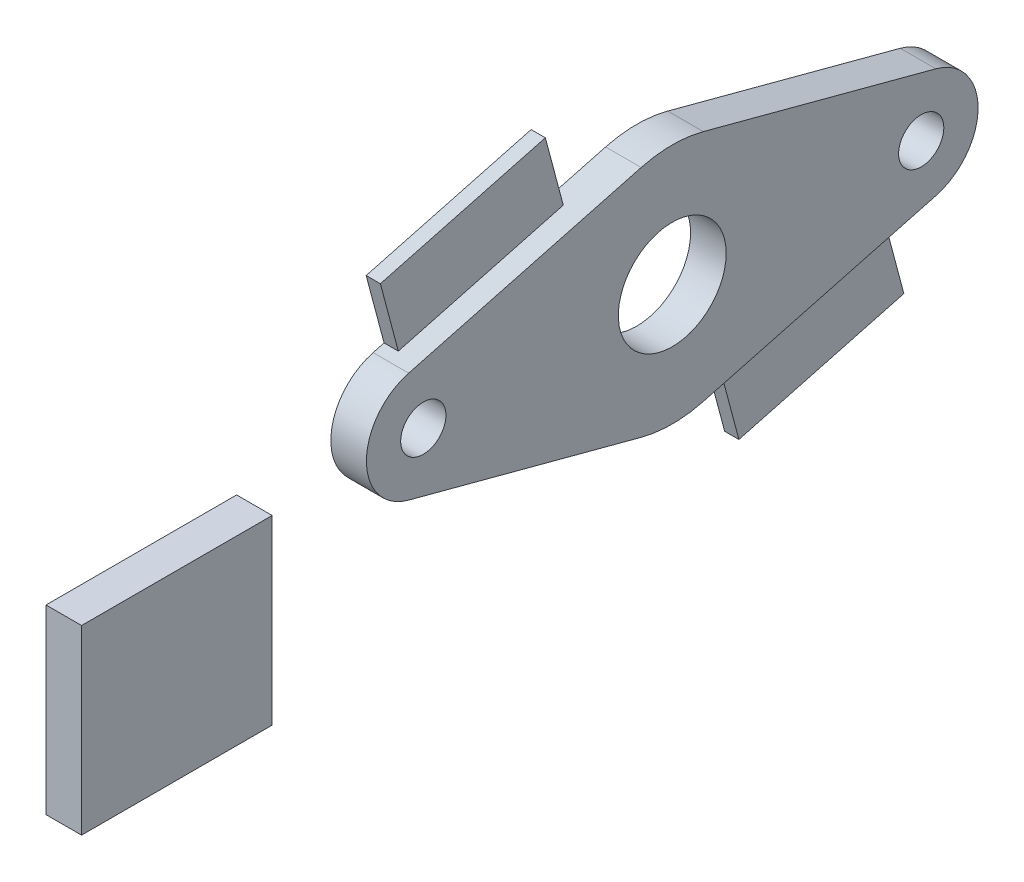
ISO-10303-21;
HEADER;
FILE_DESCRIPTION(('STEP AP214'),'2;1');
FILE_NAME('part.step','',(''),(''),'','','');
FILE_SCHEMA(('AUTOMOTIVE_DESIGN { 1 0 10303 214 1 1 1 1 }'));
ENDSEC;
DATA;
#1=APPLICATION_CONTEXT('core data for automotive mechanical design processes');
#2=APPLICATION_PROTOCOL_DEFINITION('international standard','automotive_design',2000,#1);
#3=PRODUCT_CONTEXT('',#1,'mechanical');
#4=PRODUCT('Part','Part','',(#3));
#5=PRODUCT_RELATED_PRODUCT_CATEGORY('part','',(#4));
#6=PRODUCT_DEFINITION_FORMATION('','',#4);
#7=PRODUCT_DEFINITION_CONTEXT('part definition',#1,'design');
#8=PRODUCT_DEFINITION('design','',#6,#7);
#9=PRODUCT_DEFINITION_SHAPE('','',#8);
#10=(LENGTH_UNIT() NAMED_UNIT(*) SI_UNIT(.MILLI.,.METRE.));
#11=(NAMED_UNIT(*) PLANE_ANGLE_UNIT() SI_UNIT($,.RADIAN.));
#12=(NAMED_UNIT(*) SI_UNIT($,.STERADIAN.) SOLID_ANGLE_UNIT());
#13=UNCERTAINTY_MEASURE_WITH_UNIT(LENGTH_MEASURE(1.E-05),#10,'distance_accuracy_value','');
#14=(GEOMETRIC_REPRESENTATION_CONTEXT(3) GLOBAL_UNCERTAINTY_ASSIGNED_CONTEXT((#13)) GLOBAL_UNIT_ASSIGNED_CONTEXT((#10,
#11,#12)) REPRESENTATION_CONTEXT('',''));
#15=CARTESIAN_POINT('',(0.,0.,0.));
#16=DIRECTION('',(0.,0.,1.));
#17=DIRECTION('',(1.,0.,0.));
#18=AXIS2_PLACEMENT_3D('',#15,#16,#17);
#19=CARTESIAN_POINT('',(-3.175,0.,22.225));
#20=DIRECTION('',(-1.,0.,0.));
#21=DIRECTION('',(0.,0.,1.));
#22=AXIS2_PLACEMENT_3D('',#19,#20,#21);
#23=PLANE('',#22);
#24=DIRECTION('',(0.,1.,0.));
#25=VECTOR('',#24,1.);
#26=CARTESIAN_POINT('',(-3.175,-16.2109368753439,35.7172212776602));
#27=LINE('',#26,#25);
#28=CARTESIAN_POINT('',(-3.175,-16.2109368753439,35.7172212776602));
#29=VERTEX_POINT('',#28);
#30=CARTESIAN_POINT('',(-3.175,0.,35.7172212776602));
#31=VERTEX_POINT('',#30);
#32=EDGE_CURVE('E57',#29,#31,#27,.T.);
#33=ORIENTED_EDGE('',*,*,#32,.F.);
#34=DIRECTION('',(0.,0.,-1.));
#35=VECTOR('',#34,1.);
#36=CARTESIAN_POINT('',(-3.175,-16.2109368753439,35.7172212776602));
#37=LINE('',#36,#35);
#38=CARTESIAN_POINT('',(-3.175,-16.2109368753439,52.7326155470547));
#39=VERTEX_POINT('',#38);
#40=EDGE_CURVE('E80',#39,#29,#37,.T.);
#41=ORIENTED_EDGE('',*,*,#40,.F.);
#42=DIRECTION('',(0.,-1.,0.));
#43=VECTOR('',#42,1.);
#44=CARTESIAN_POINT('',(-3.175,-16.2109368753439,52.7326155470547));
#45=LINE('',#44,#43);
#46=CARTESIAN_POINT('',(-3.175,0.,52.7326155470547));
#47=VERTEX_POINT('',#46);
#48=EDGE_CURVE('E85',#47,#39,#45,.T.);
#49=ORIENTED_EDGE('',*,*,#48,.F.);
#50=DIRECTION('',(0.,0.,1.));
#51=VECTOR('',#50,1.);
#52=CARTESIAN_POINT('',(-3.175,0.,35.7172212776602));
#53=LINE('',#52,#51);
#54=EDGE_CURVE('E100',#31,#47,#53,.T.);
#55=ORIENTED_EDGE('',*,*,#54,.F.);
#56=EDGE_LOOP('',(#33,#41,#49,#55));
#57=FACE_BOUND('',#56,.T.);
#58=ADVANCED_FACE('F49',(#57),#23,.T.);
#59=CARTESIAN_POINT('',(0.,0.,0.));
#60=DIRECTION('',(1.,0.,0.));
#61=DIRECTION('',(0.,0.,-1.));
#62=AXIS2_PLACEMENT_3D('',#59,#60,#61);
#63=PLANE('',#62);
#64=DIRECTION('',(0.,1.,0.));
#65=VECTOR('',#64,1.);
#66=CARTESIAN_POINT('',(0.,-16.2109368753439,35.7172212776602));
#67=LINE('',#66,#65);
#68=CARTESIAN_POINT('',(0.,-16.2109368753439,35.7172212776602));
#69=VERTEX_POINT('',#68);
#70=CARTESIAN_POINT('',(0.,0.,35.7172212776602));
#71=VERTEX_POINT('',#70);
#72=EDGE_CURVE('E109',#69,#71,#67,.T.);
#73=ORIENTED_EDGE('',*,*,#72,.T.);
#74=DIRECTION('',(0.,0.,1.));
#75=VECTOR('',#74,1.);
#76=CARTESIAN_POINT('',(0.,0.,35.7172212776602));
#77=LINE('',#76,#75);
#78=CARTESIAN_POINT('',(0.,0.,52.7326155470547));
#79=VERTEX_POINT('',#78);
#80=EDGE_CURVE('E98',#71,#79,#77,.T.);
#81=ORIENTED_EDGE('',*,*,#80,.T.);
#82=DIRECTION('',(0.,-1.,0.));
#83=VECTOR('',#82,1.);
#84=CARTESIAN_POINT('',(0.,-16.2109368753439,52.7326155470547));
#85=LINE('',#84,#83);
#86=CARTESIAN_POINT('',(0.,-16.2109368753439,52.7326155470547));
#87=VERTEX_POINT('',#86);
#88=EDGE_CURVE('E101',#79,#87,#85,.T.);
#89=ORIENTED_EDGE('',*,*,#88,.T.);
#90=DIRECTION('',(0.,0.,-1.));
#91=VECTOR('',#90,1.);
#92=CARTESIAN_POINT('',(0.,-16.2109368753439,35.7172212776602));
#93=LINE('',#92,#91);
#94=EDGE_CURVE('E106',#87,#69,#93,.T.);
#95=ORIENTED_EDGE('',*,*,#94,.T.);
#96=EDGE_LOOP('',(#73,#81,#89,#95));
#97=FACE_BOUND('',#96,.T.);
#98=ADVANCED_FACE('F108',(#97),#63,.T.);
#99=CARTESIAN_POINT('',(-26.6764492429579,0.,35.7172212776602));
#100=DIRECTION('',(0.,1.,0.));
#101=DIRECTION('',(0.,0.,1.));
#102=AXIS2_PLACEMENT_3D('',#99,#100,#101);
#103=PLANE('',#102);
#104=DIRECTION('',(1.,0.,0.));
#105=VECTOR('',#104,1.);
#106=CARTESIAN_POINT('',(-26.6764492429579,0.,35.7172212776602));
#107=LINE('',#106,#105);
#108=EDGE_CURVE('E12',#31,#71,#107,.T.);
#109=ORIENTED_EDGE('',*,*,#108,.F.);
#110=ORIENTED_EDGE('',*,*,#54,.T.);
#111=DIRECTION('',(1.,0.,0.));
#112=VECTOR('',#111,1.);
#113=CARTESIAN_POINT('',(-26.6764492429579,0.,52.7326155470547));
#114=LINE('',#113,#112);
#115=EDGE_CURVE('E95',#47,#79,#114,.T.);
#116=ORIENTED_EDGE('',*,*,#115,.T.);
#117=ORIENTED_EDGE('',*,*,#80,.F.);
#118=EDGE_LOOP('',(#109,#110,#116,#117));
#119=FACE_BOUND('',#118,.T.);
#120=ADVANCED_FACE('F96',(#119),#103,.T.);
#121=CARTESIAN_POINT('',(-26.6764492429579,-16.2109368753439,52.7326155470547));
#122=DIRECTION('',(0.,0.,1.));
#123=DIRECTION('',(1.,0.,0.));
#124=AXIS2_PLACEMENT_3D('',#121,#122,#123);
#125=PLANE('',#124);
#126=ORIENTED_EDGE('',*,*,#115,.F.);
#127=ORIENTED_EDGE('',*,*,#48,.T.);
#128=DIRECTION('',(1.,0.,0.));
#129=VECTOR('',#128,1.);
#130=CARTESIAN_POINT('',(-26.6764492429579,-16.2109368753439,52.7326155470547));
#131=LINE('',#130,#129);
#132=EDGE_CURVE('E90',#39,#87,#131,.T.);
#133=ORIENTED_EDGE('',*,*,#132,.T.);
#134=ORIENTED_EDGE('',*,*,#88,.F.);
#135=EDGE_LOOP('',(#126,#127,#133,#134));
#136=FACE_BOUND('',#135,.T.);
#137=ADVANCED_FACE('F102',(#136),#125,.T.);
#138=CARTESIAN_POINT('',(-26.6764492429579,-16.2109368753439,35.7172212776602));
#139=DIRECTION('',(0.,-1.,0.));
#140=DIRECTION('',(0.,0.,-1.));
#141=AXIS2_PLACEMENT_3D('',#138,#139,#140);
#142=PLANE('',#141);
#143=ORIENTED_EDGE('',*,*,#132,.F.);
#144=ORIENTED_EDGE('',*,*,#40,.T.);
#145=DIRECTION('',(1.,0.,0.));
#146=VECTOR('',#145,1.);
#147=CARTESIAN_POINT('',(-26.6764492429579,-16.2109368753439,35.7172212776602));
#148=LINE('',#147,#146);
#149=EDGE_CURVE('E116',#29,#69,#148,.T.);
#150=ORIENTED_EDGE('',*,*,#149,.T.);
#151=ORIENTED_EDGE('',*,*,#94,.F.);
#152=EDGE_LOOP('',(#143,#144,#150,#151));
#153=FACE_BOUND('',#152,.T.);
#154=ADVANCED_FACE('F122',(#153),#142,.T.);
#155=CARTESIAN_POINT('',(-26.6764492429579,-16.2109368753439,35.7172212776602));
#156=DIRECTION('',(0.,0.,-1.));
#157=DIRECTION('',(-1.,0.,0.));
#158=AXIS2_PLACEMENT_3D('',#155,#156,#157);
#159=PLANE('',#158);
#160=ORIENTED_EDGE('',*,*,#149,.F.);
#161=ORIENTED_EDGE('',*,*,#32,.T.);
#162=ORIENTED_EDGE('',*,*,#108,.T.);
#163=ORIENTED_EDGE('',*,*,#72,.F.);
#164=EDGE_LOOP('',(#160,#161,#162,#163));
#165=FACE_BOUND('',#164,.T.);
#166=ADVANCED_FACE('F123',(#165),#159,.T.);
#167=CLOSED_SHELL('',(#58,#98,#120,#137,#154,#166));
#168=MANIFOLD_SOLID_BREP('B2',#167);
#169=CARTESIAN_POINT('',(-3.175,0.,22.225));
#170=DIRECTION('',(1.,0.,0.));
#171=DIRECTION('',(0.,0.,-1.));
#172=AXIS2_PLACEMENT_3D('',#169,#170,#171);
#173=CYLINDRICAL_SURFACE('',#172,5.08);
#174=CARTESIAN_POINT('',(0.,0.,22.225));
#175=DIRECTION('',(1.,0.,0.));
#176=DIRECTION('',(0.,0.,1.));
#177=AXIS2_PLACEMENT_3D('',#174,#175,#176);
#178=CIRCLE('',#177,5.08);
#179=CARTESIAN_POINT('',(0.,4.90917687934067,23.5312857142857));
#180=VERTEX_POINT('',#179);
#181=CARTESIAN_POINT('',(0.,-4.90917687934068,23.5312857142857));
#182=VERTEX_POINT('',#181);
#183=EDGE_CURVE('E413',#180,#182,#178,.T.);
#184=ORIENTED_EDGE('',*,*,#183,.F.);
#185=DIRECTION('',(1.,0.,0.));
#186=VECTOR('',#185,1.);
#187=CARTESIAN_POINT('',(-3.175,4.90917687934067,23.5312857142857));
#188=LINE('',#187,#186);
#189=CARTESIAN_POINT('',(-3.175,4.90917687934067,23.5312857142857));
#190=VERTEX_POINT('',#189);
#191=EDGE_CURVE('E47',#190,#180,#188,.T.);
#192=ORIENTED_EDGE('',*,*,#191,.F.);
#193=CARTESIAN_POINT('',(-3.175,0.,22.225));
#194=DIRECTION('',(1.,0.,0.));
#195=DIRECTION('',(0.,0.,1.));
#196=AXIS2_PLACEMENT_3D('',#193,#194,#195);
#197=CIRCLE('',#196,5.08);
#198=CARTESIAN_POINT('',(-3.175,-4.90917687934068,23.5312857142857));
#199=VERTEX_POINT('',#198);
#200=EDGE_CURVE('E388',#190,#199,#197,.T.);
#201=ORIENTED_EDGE('',*,*,#200,.T.);
#202=DIRECTION('',(1.,0.,0.));
#203=VECTOR('',#202,1.);
#204=CARTESIAN_POINT('',(-3.175,-4.90917687934068,23.5312857142857));
#205=LINE('',#204,#203);
#206=EDGE_CURVE('E177',#199,#182,#205,.T.);
#207=ORIENTED_EDGE('',*,*,#206,.T.);
#208=EDGE_LOOP('',(#184,#192,#201,#207));
#209=FACE_BOUND('',#208,.T.);
#210=ADVANCED_FACE('F174',(#209),#173,.T.);
#211=CARTESIAN_POINT('',(-3.175,4.90917687934067,23.5312857142857));
#212=DIRECTION('',(0.,0.966373401445015,0.257142857142857));
#213=DIRECTION('',(0.,-0.257142857142857,0.966373401445015));
#214=AXIS2_PLACEMENT_3D('',#211,#212,#213);
#215=PLANE('',#214);
#216=DIRECTION('',(-1.,0.,0.));
#217=VECTOR('',#216,1.);
#218=CARTESIAN_POINT('',(-1.905,9.08874273440461,7.82398076792403));
#219=LINE('',#218,#217);
#220=CARTESIAN_POINT('',(-1.905,9.08874273440461,7.82398076792403));
#221=VERTEX_POINT('',#220);
#222=CARTESIAN_POINT('',(-3.175,9.08874273440461,7.82398076792402));
#223=VERTEX_POINT('',#222);
#224=EDGE_CURVE('E190',#221,#223,#219,.T.);
#225=ORIENTED_EDGE('',*,*,#224,.F.);
#226=DIRECTION('',(0.,-0.257142857142857,0.966373401445015));
#227=VECTOR('',#226,1.);
#228=CARTESIAN_POINT('',(-1.905,9.08874273440461,7.82398076792403));
#229=LINE('',#228,#227);
#230=CARTESIAN_POINT('',(-1.905,5.16988559154746,22.5515114059461));
#231=VERTEX_POINT('',#230);
#232=EDGE_CURVE('E194',#221,#231,#229,.T.);
#233=ORIENTED_EDGE('',*,*,#232,.T.);
#234=DIRECTION('',(-1.,0.,0.));
#235=VECTOR('',#234,1.);
#236=CARTESIAN_POINT('',(-1.905,5.16988559154746,22.5515114059461));
#237=LINE('',#236,#235);
#238=CARTESIAN_POINT('',(-3.175,5.16988559154746,22.5515114059461));
#239=VERTEX_POINT('',#238);
#240=EDGE_CURVE('E297',#231,#239,#237,.T.);
#241=ORIENTED_EDGE('',*,*,#240,.T.);
#242=DIRECTION('',(0.,-0.257142857142857,0.966373401445015));
#243=VECTOR('',#242,1.);
#244=CARTESIAN_POINT('',(-3.175,4.90917687934067,23.5312857142857));
#245=LINE('',#244,#243);
#246=EDGE_CURVE('E407',#239,#190,#245,.T.);
#247=ORIENTED_EDGE('',*,*,#246,.T.);
#248=ORIENTED_EDGE('',*,*,#191,.T.);
#249=DIRECTION('',(0.,-0.257142857142857,0.966373401445015));
#250=VECTOR('',#249,1.);
#251=CARTESIAN_POINT('',(0.,4.90917687934067,23.5312857142857));
#252=LINE('',#251,#250);
#253=CARTESIAN_POINT('',(0.,10.4320008685989,2.77585714285714));
#254=VERTEX_POINT('',#253);
#255=EDGE_CURVE('E386',#254,#180,#252,.T.);
#256=ORIENTED_EDGE('',*,*,#255,.F.);
#257=DIRECTION('',(1.,0.,0.));
#258=VECTOR('',#257,1.);
#259=CARTESIAN_POINT('',(-3.175,10.4320008685989,2.77585714285714));
#260=LINE('',#259,#258);
#261=CARTESIAN_POINT('',(-3.175,10.4320008685989,2.77585714285714));
#262=VERTEX_POINT('',#261);
#263=EDGE_CURVE('E182',#262,#254,#260,.T.);
#264=ORIENTED_EDGE('',*,*,#263,.F.);
#265=EDGE_CURVE('E403',#262,#223,#245,.T.);
#266=ORIENTED_EDGE('',*,*,#265,.T.);
#267=EDGE_LOOP('',(#225,#233,#241,#247,#248,#256,#264,#266));
#268=FACE_BOUND('',#267,.T.);
#269=ADVANCED_FACE('F467',(#268),#215,.T.);
#270=CARTESIAN_POINT('',(-3.175,0.,0.));
#271=DIRECTION('',(1.,0.,0.));
#272=DIRECTION('',(0.,0.,-1.));
#273=AXIS2_PLACEMENT_3D('',#270,#271,#272);
#274=CYLINDRICAL_SURFACE('',#273,10.795);
#275=CARTESIAN_POINT('',(0.,0.,0.));
#276=DIRECTION('',(1.,0.,0.));
#277=DIRECTION('',(0.,0.,1.));
#278=AXIS2_PLACEMENT_3D('',#275,#276,#277);
#279=CIRCLE('',#278,10.795);
#280=CARTESIAN_POINT('',(0.,10.4320008685989,-2.77585714285715));
#281=VERTEX_POINT('',#280);
#282=EDGE_CURVE('E383',#281,#254,#279,.T.);
#283=ORIENTED_EDGE('',*,*,#282,.F.);
#284=DIRECTION('',(1.,0.,0.));
#285=VECTOR('',#284,1.);
#286=CARTESIAN_POINT('',(-3.175,10.4320008685989,-2.77585714285715));
#287=LINE('',#286,#285);
#288=CARTESIAN_POINT('',(-3.175,10.4320008685989,-2.77585714285715));
#289=VERTEX_POINT('',#288);
#290=EDGE_CURVE('E391',#289,#281,#287,.T.);
#291=ORIENTED_EDGE('',*,*,#290,.F.);
#292=CARTESIAN_POINT('',(-3.175,0.,0.));
#293=DIRECTION('',(1.,0.,0.));
#294=DIRECTION('',(0.,0.,1.));
#295=AXIS2_PLACEMENT_3D('',#292,#293,#294);
#296=CIRCLE('',#295,10.795);
#297=EDGE_CURVE('E409',#289,#262,#296,.T.);
#298=ORIENTED_EDGE('',*,*,#297,.T.);
#299=ORIENTED_EDGE('',*,*,#263,.T.);
#300=EDGE_LOOP('',(#283,#291,#298,#299));
#301=FACE_BOUND('',#300,.T.);
#302=ADVANCED_FACE('F446',(#301),#274,.T.);
#303=CARTESIAN_POINT('',(-3.175,10.4320008685989,-2.77585714285715));
#304=DIRECTION('',(0.,0.966373401445015,-0.257142857142858));
#305=DIRECTION('',(0.,0.257142857142858,0.966373401445015));
#306=AXIS2_PLACEMENT_3D('',#303,#304,#305);
#307=PLANE('',#306);
#308=DIRECTION('',(0.,0.257142857142858,0.966373401445015));
#309=VECTOR('',#308,1.);
#310=CARTESIAN_POINT('',(0.,10.4320008685989,-2.77585714285715));
#311=LINE('',#310,#309);
#312=CARTESIAN_POINT('',(0.,4.90917687934068,-23.5312857142857));
#313=VERTEX_POINT('',#312);
#314=EDGE_CURVE('E380',#313,#281,#311,.T.);
#315=ORIENTED_EDGE('',*,*,#314,.F.);
#316=DIRECTION('',(1.,0.,0.));
#317=VECTOR('',#316,1.);
#318=CARTESIAN_POINT('',(-3.175,4.90917687934068,-23.5312857142857));
#319=LINE('',#318,#317);
#320=CARTESIAN_POINT('',(-3.175,4.90917687934068,-23.5312857142857));
#321=VERTEX_POINT('',#320);
#322=EDGE_CURVE('E393',#321,#313,#319,.T.);
#323=ORIENTED_EDGE('',*,*,#322,.F.);
#324=DIRECTION('',(0.,0.257142857142858,0.966373401445015));
#325=VECTOR('',#324,1.);
#326=CARTESIAN_POINT('',(-3.175,10.4320008685989,-2.77585714285715));
#327=LINE('',#326,#325);
#328=EDGE_CURVE('E437',#321,#289,#327,.T.);
#329=ORIENTED_EDGE('',*,*,#328,.T.);
#330=ORIENTED_EDGE('',*,*,#290,.T.);
#331=EDGE_LOOP('',(#315,#323,#329,#330));
#332=FACE_BOUND('',#331,.T.);
#333=ADVANCED_FACE('F490',(#332),#307,.T.);
#334=CARTESIAN_POINT('',(-3.175,0.,-22.225));
#335=DIRECTION('',(1.,0.,0.));
#336=DIRECTION('',(0.,0.,-1.));
#337=AXIS2_PLACEMENT_3D('',#334,#335,#336);
#338=CYLINDRICAL_SURFACE('',#337,5.08);
#339=CARTESIAN_POINT('',(0.,0.,-22.225));
#340=DIRECTION('',(1.,0.,0.));
#341=DIRECTION('',(0.,0.,1.));
#342=AXIS2_PLACEMENT_3D('',#339,#340,#341);
#343=CIRCLE('',#342,5.08);
#344=CARTESIAN_POINT('',(0.,-4.90917687934067,-23.5312857142857));
#345=VERTEX_POINT('',#344);
#346=EDGE_CURVE('E377',#345,#313,#343,.T.);
#347=ORIENTED_EDGE('',*,*,#346,.F.);
#348=DIRECTION('',(1.,0.,0.));
#349=VECTOR('',#348,1.);
#350=CARTESIAN_POINT('',(-3.175,-4.90917687934067,-23.5312857142857));
#351=LINE('',#350,#349);
#352=CARTESIAN_POINT('',(-3.175,-4.90917687934067,-23.5312857142857));
#353=VERTEX_POINT('',#352);
#354=EDGE_CURVE('E395',#353,#345,#351,.T.);
#355=ORIENTED_EDGE('',*,*,#354,.F.);
#356=CARTESIAN_POINT('',(-3.175,0.,-22.225));
#357=DIRECTION('',(1.,0.,0.));
#358=DIRECTION('',(0.,0.,1.));
#359=AXIS2_PLACEMENT_3D('',#356,#357,#358);
#360=CIRCLE('',#359,5.08);
#361=EDGE_CURVE('E435',#353,#321,#360,.T.);
#362=ORIENTED_EDGE('',*,*,#361,.T.);
#363=ORIENTED_EDGE('',*,*,#322,.T.);
#364=EDGE_LOOP('',(#347,#355,#362,#363));
#365=FACE_BOUND('',#364,.T.);
#366=ADVANCED_FACE('F488',(#365),#338,.T.);
#367=CARTESIAN_POINT('',(-3.175,-4.90917687934068,-23.5312857142857));
#368=DIRECTION('',(0.,-0.966373401445015,-0.257142857142858));
#369=DIRECTION('',(0.,0.257142857142858,-0.966373401445015));
#370=AXIS2_PLACEMENT_3D('',#367,#368,#369);
#371=PLANE('',#370);
#372=DIRECTION('',(-1.,0.,0.));
#373=VECTOR('',#372,1.);
#374=CARTESIAN_POINT('',(-1.905,-9.59562118272561,-5.91907135038965));
#375=LINE('',#374,#373);
#376=CARTESIAN_POINT('',(-1.905,-9.59562118272561,-5.91907135038965));
#377=VERTEX_POINT('',#376);
#378=CARTESIAN_POINT('',(-3.175,-9.59562118272561,-5.91907135038965));
#379=VERTEX_POINT('',#378);
#380=EDGE_CURVE('E333',#377,#379,#375,.T.);
#381=ORIENTED_EDGE('',*,*,#380,.F.);
#382=DIRECTION('',(0.,0.257142857142858,-0.966373401445015));
#383=VECTOR('',#382,1.);
#384=CARTESIAN_POINT('',(-1.905,-9.59562118272561,-5.91907135038965));
#385=LINE('',#384,#383);
#386=CARTESIAN_POINT('',(-1.905,-5.67676403986846,-20.6466019884117));
#387=VERTEX_POINT('',#386);
#388=EDGE_CURVE('E324',#377,#387,#385,.T.);
#389=ORIENTED_EDGE('',*,*,#388,.T.);
#390=DIRECTION('',(-1.,0.,0.));
#391=VECTOR('',#390,1.);
#392=CARTESIAN_POINT('',(-1.905,-5.67676403986846,-20.6466019884117));
#393=LINE('',#392,#391);
#394=CARTESIAN_POINT('',(-3.175,-5.67676403986846,-20.6466019884117));
#395=VERTEX_POINT('',#394);
#396=EDGE_CURVE('E346',#387,#395,#393,.T.);
#397=ORIENTED_EDGE('',*,*,#396,.T.);
#398=DIRECTION('',(0.,0.257142857142858,-0.966373401445015));
#399=VECTOR('',#398,1.);
#400=CARTESIAN_POINT('',(-3.175,-4.90917687934068,-23.5312857142857));
#401=LINE('',#400,#399);
#402=EDGE_CURVE('E431',#395,#353,#401,.T.);
#403=ORIENTED_EDGE('',*,*,#402,.T.);
#404=ORIENTED_EDGE('',*,*,#354,.T.);
#405=DIRECTION('',(0.,0.257142857142858,-0.966373401445015));
#406=VECTOR('',#405,1.);
#407=CARTESIAN_POINT('',(0.,-4.90917687934068,-23.5312857142857));
#408=LINE('',#407,#406);
#409=CARTESIAN_POINT('',(0.,-10.4320008685989,-2.77585714285715));
#410=VERTEX_POINT('',#409);
#411=EDGE_CURVE('E372',#410,#345,#408,.T.);
#412=ORIENTED_EDGE('',*,*,#411,.F.);
#413=DIRECTION('',(1.,0.,0.));
#414=VECTOR('',#413,1.);
#415=CARTESIAN_POINT('',(-3.175,-10.4320008685989,-2.77585714285715));
#416=LINE('',#415,#414);
#417=CARTESIAN_POINT('',(-3.175,-10.4320008685989,-2.77585714285715));
#418=VERTEX_POINT('',#417);
#419=EDGE_CURVE('E397',#418,#410,#416,.T.);
#420=ORIENTED_EDGE('',*,*,#419,.F.);
#421=EDGE_CURVE('E432',#418,#379,#401,.T.);
#422=ORIENTED_EDGE('',*,*,#421,.T.);
#423=EDGE_LOOP('',(#381,#389,#397,#403,#404,#412,#420,#422));
#424=FACE_BOUND('',#423,.T.);
#425=ADVANCED_FACE('F483',(#424),#371,.T.);
#426=CARTESIAN_POINT('',(-3.175,0.,0.));
#427=DIRECTION('',(1.,0.,0.));
#428=DIRECTION('',(0.,0.,-1.));
#429=AXIS2_PLACEMENT_3D('',#426,#427,#428);
#430=CYLINDRICAL_SURFACE('',#429,10.795);
#431=CARTESIAN_POINT('',(0.,0.,0.));
#432=DIRECTION('',(1.,0.,0.));
#433=DIRECTION('',(0.,0.,1.));
#434=AXIS2_PLACEMENT_3D('',#431,#432,#433);
#435=CIRCLE('',#434,10.795);
#436=CARTESIAN_POINT('',(0.,-10.4320008685989,2.77585714285714));
#437=VERTEX_POINT('',#436);
#438=EDGE_CURVE('E367',#437,#410,#435,.T.);
#439=ORIENTED_EDGE('',*,*,#438,.F.);
#440=DIRECTION('',(1.,0.,0.));
#441=VECTOR('',#440,1.);
#442=CARTESIAN_POINT('',(-3.175,-10.4320008685989,2.77585714285714));
#443=LINE('',#442,#441);
#444=CARTESIAN_POINT('',(-3.175,-10.4320008685989,2.77585714285714));
#445=VERTEX_POINT('',#444);
#446=EDGE_CURVE('E398',#445,#437,#443,.T.);
#447=ORIENTED_EDGE('',*,*,#446,.F.);
#448=CARTESIAN_POINT('',(-3.175,0.,0.));
#449=DIRECTION('',(1.,0.,0.));
#450=DIRECTION('',(0.,0.,1.));
#451=AXIS2_PLACEMENT_3D('',#448,#449,#450);
#452=CIRCLE('',#451,10.795);
#453=EDGE_CURVE('E429',#445,#418,#452,.T.);
#454=ORIENTED_EDGE('',*,*,#453,.T.);
#455=ORIENTED_EDGE('',*,*,#419,.T.);
#456=EDGE_LOOP('',(#439,#447,#454,#455));
#457=FACE_BOUND('',#456,.T.);
#458=ADVANCED_FACE('F481',(#457),#430,.T.);
#459=CARTESIAN_POINT('',(-3.175,-10.4320008685989,2.77585714285714));
#460=DIRECTION('',(0.,-0.966373401445015,0.257142857142857));
#461=DIRECTION('',(0.,-0.257142857142857,-0.966373401445015));
#462=AXIS2_PLACEMENT_3D('',#459,#460,#461);
#463=PLANE('',#462);
#464=DIRECTION('',(0.,-0.257142857142857,-0.966373401445015));
#465=VECTOR('',#464,1.);
#466=CARTESIAN_POINT('',(0.,-10.4320008685989,2.77585714285714));
#467=LINE('',#466,#465);
#468=EDGE_CURVE('E373',#182,#437,#467,.T.);
#469=ORIENTED_EDGE('',*,*,#468,.F.);
#470=ORIENTED_EDGE('',*,*,#206,.F.);
#471=DIRECTION('',(0.,-0.257142857142857,-0.966373401445015));
#472=VECTOR('',#471,1.);
#473=CARTESIAN_POINT('',(-3.175,-10.4320008685989,2.77585714285714));
#474=LINE('',#473,#472);
#475=EDGE_CURVE('E426',#199,#445,#474,.T.);
#476=ORIENTED_EDGE('',*,*,#475,.T.);
#477=ORIENTED_EDGE('',*,*,#446,.T.);
#478=EDGE_LOOP('',(#469,#470,#476,#477));
#479=FACE_BOUND('',#478,.T.);
#480=ADVANCED_FACE('F478',(#479),#463,.T.);
#481=CARTESIAN_POINT('',(-3.175,0.,22.225));
#482=DIRECTION('',(-1.,0.,0.));
#483=DIRECTION('',(0.,0.,1.));
#484=AXIS2_PLACEMENT_3D('',#481,#482,#483);
#485=PLANE('',#484);
#486=CARTESIAN_POINT('',(-3.175,0.,0.));
#487=DIRECTION('',(1.,0.,0.));
#488=DIRECTION('',(0.,0.,-1.));
#489=AXIS2_PLACEMENT_3D('',#486,#487,#488);
#490=CIRCLE('',#489,4.8133);
#491=CARTESIAN_POINT('',(-3.175,0.,-4.8133));
#492=VERTEX_POINT('',#491);
#493=EDGE_CURVE('E351',#492,#492,#490,.T.);
#494=ORIENTED_EDGE('',*,*,#493,.T.);
#495=EDGE_LOOP('',(#494));
#496=FACE_BOUND('',#495,.T.);
#497=CARTESIAN_POINT('',(-3.175,0.,22.225));
#498=DIRECTION('',(1.,0.,0.));
#499=DIRECTION('',(0.,0.,-1.));
#500=AXIS2_PLACEMENT_3D('',#497,#498,#499);
#501=CIRCLE('',#500,2.0193);
#502=CARTESIAN_POINT('',(-3.175,0.,20.2057));
#503=VERTEX_POINT('',#502);
#504=EDGE_CURVE('E358',#503,#503,#501,.T.);
#505=ORIENTED_EDGE('',*,*,#504,.T.);
#506=EDGE_LOOP('',(#505));
#507=FACE_BOUND('',#506,.T.);
#508=CARTESIAN_POINT('',(-3.175,0.,-22.225));
#509=DIRECTION('',(1.,0.,0.));
#510=DIRECTION('',(0.,0.,-1.));
#511=AXIS2_PLACEMENT_3D('',#508,#509,#510);
#512=CIRCLE('',#511,2.0193);
#513=CARTESIAN_POINT('',(-3.175,0.,-24.2443));
#514=VERTEX_POINT('',#513);
#515=EDGE_CURVE('E415',#514,#514,#512,.T.);
#516=ORIENTED_EDGE('',*,*,#515,.T.);
#517=EDGE_LOOP('',(#516));
#518=FACE_BOUND('',#517,.T.);
#519=ORIENTED_EDGE('',*,*,#200,.F.);
#520=ORIENTED_EDGE('',*,*,#246,.F.);
#521=DIRECTION('',(0.,0.966373401445015,0.257142857142857));
#522=VECTOR('',#521,1.);
#523=CARTESIAN_POINT('',(-3.175,5.16988559154746,22.5515114059461));
#524=LINE('',#523,#522);
#525=CARTESIAN_POINT('',(-3.175,11.1809090394382,24.1509881107395));
#526=VERTEX_POINT('',#525);
#527=EDGE_CURVE('E315',#239,#526,#524,.T.);
#528=ORIENTED_EDGE('',*,*,#527,.T.);
#529=DIRECTION('',(0.,0.257142857142857,-0.966373401445015));
#530=VECTOR('',#529,1.);
#531=CARTESIAN_POINT('',(-3.175,15.0997661822953,9.42345747271749));
#532=LINE('',#531,#530);
#533=CARTESIAN_POINT('',(-3.175,15.0997661822953,9.42345747271749));
#534=VERTEX_POINT('',#533);
#535=EDGE_CURVE('E292',#526,#534,#532,.T.);
#536=ORIENTED_EDGE('',*,*,#535,.T.);
#537=DIRECTION('',(0.,-0.966373401445015,-0.257142857142857));
#538=VECTOR('',#537,1.);
#539=CARTESIAN_POINT('',(-3.175,9.08874273440461,7.82398076792403));
#540=LINE('',#539,#538);
#541=EDGE_CURVE('E312',#534,#223,#540,.T.);
#542=ORIENTED_EDGE('',*,*,#541,.T.);
#543=ORIENTED_EDGE('',*,*,#265,.F.);
#544=ORIENTED_EDGE('',*,*,#297,.F.);
#545=ORIENTED_EDGE('',*,*,#328,.F.);
#546=ORIENTED_EDGE('',*,*,#361,.F.);
#547=ORIENTED_EDGE('',*,*,#402,.F.);
#548=DIRECTION('',(0.,-0.966373401445015,-0.257142857142858));
#549=VECTOR('',#548,1.);
#550=CARTESIAN_POINT('',(-3.175,-5.67676403986846,-20.6466019884117));
#551=LINE('',#550,#549);
#552=CARTESIAN_POINT('',(-3.175,-12.949580858723,-22.5818300208476));
#553=VERTEX_POINT('',#552);
#554=EDGE_CURVE('E336',#395,#553,#551,.T.);
#555=ORIENTED_EDGE('',*,*,#554,.T.);
#556=DIRECTION('',(0.,-0.257142857142857,0.966373401445015));
#557=VECTOR('',#556,1.);
#558=CARTESIAN_POINT('',(-3.175,-16.8684380015802,-7.85429938282562));
#559=LINE('',#558,#557);
#560=CARTESIAN_POINT('',(-3.175,-16.8684380015802,-7.85429938282562));
#561=VERTEX_POINT('',#560);
#562=EDGE_CURVE('E325',#553,#561,#559,.T.);
#563=ORIENTED_EDGE('',*,*,#562,.T.);
#564=DIRECTION('',(0.,0.966373401445015,0.257142857142857));
#565=VECTOR('',#564,1.);
#566=CARTESIAN_POINT('',(-3.175,-9.59562118272561,-5.91907135038965));
#567=LINE('',#566,#565);
#568=EDGE_CURVE('E318',#561,#379,#567,.T.);
#569=ORIENTED_EDGE('',*,*,#568,.T.);
#570=ORIENTED_EDGE('',*,*,#421,.F.);
#571=ORIENTED_EDGE('',*,*,#453,.F.);
#572=ORIENTED_EDGE('',*,*,#475,.F.);
#573=EDGE_LOOP('',(#519,#520,#528,#536,#542,#543,#544,#545,#546,#547,#555,#563,#569,#570,#571,#572));
#574=FACE_BOUND('',#573,.T.);
#575=ADVANCED_FACE('F449',(#496,#507,#518,#574),#485,.T.);
#576=CARTESIAN_POINT('',(0.,0.,22.225));
#577=DIRECTION('',(-1.,0.,0.));
#578=DIRECTION('',(0.,0.,1.));
#579=AXIS2_PLACEMENT_3D('',#576,#577,#578);
#580=PLANE('',#579);
#581=CARTESIAN_POINT('',(0.,0.,0.));
#582=DIRECTION('',(1.,0.,0.));
#583=DIRECTION('',(0.,0.,-1.));
#584=AXIS2_PLACEMENT_3D('',#581,#582,#583);
#585=CIRCLE('',#584,4.8133);
#586=CARTESIAN_POINT('',(0.,0.,-4.8133));
#587=VERTEX_POINT('',#586);
#588=EDGE_CURVE('E343',#587,#587,#585,.T.);
#589=ORIENTED_EDGE('',*,*,#588,.F.);
#590=EDGE_LOOP('',(#589));
#591=FACE_BOUND('',#590,.T.);
#592=CARTESIAN_POINT('',(0.,0.,22.225));
#593=DIRECTION('',(1.,0.,0.));
#594=DIRECTION('',(0.,0.,-1.));
#595=AXIS2_PLACEMENT_3D('',#592,#593,#594);
#596=CIRCLE('',#595,2.0193);
#597=CARTESIAN_POINT('',(0.,0.,20.2057));
#598=VERTEX_POINT('',#597);
#599=EDGE_CURVE('E354',#598,#598,#596,.T.);
#600=ORIENTED_EDGE('',*,*,#599,.F.);
#601=EDGE_LOOP('',(#600));
#602=FACE_BOUND('',#601,.T.);
#603=CARTESIAN_POINT('',(0.,0.,-22.225));
#604=DIRECTION('',(1.,0.,0.));
#605=DIRECTION('',(0.,0.,-1.));
#606=AXIS2_PLACEMENT_3D('',#603,#604,#605);
#607=CIRCLE('',#606,2.0193);
#608=CARTESIAN_POINT('',(0.,0.,-24.2443));
#609=VERTEX_POINT('',#608);
#610=EDGE_CURVE('E419',#609,#609,#607,.T.);
#611=ORIENTED_EDGE('',*,*,#610,.F.);
#612=EDGE_LOOP('',(#611));
#613=FACE_BOUND('',#612,.T.);
#614=ORIENTED_EDGE('',*,*,#183,.T.);
#615=ORIENTED_EDGE('',*,*,#468,.T.);
#616=ORIENTED_EDGE('',*,*,#438,.T.);
#617=ORIENTED_EDGE('',*,*,#411,.T.);
#618=ORIENTED_EDGE('',*,*,#346,.T.);
#619=ORIENTED_EDGE('',*,*,#314,.T.);
#620=ORIENTED_EDGE('',*,*,#282,.T.);
#621=ORIENTED_EDGE('',*,*,#255,.T.);
#622=EDGE_LOOP('',(#614,#615,#616,#617,#618,#619,#620,#621));
#623=FACE_BOUND('',#622,.T.);
#624=ADVANCED_FACE('F474',(#591,#602,#613,#623),#580,.F.);
#625=CARTESIAN_POINT('',(-3.175,0.,-22.225));
#626=DIRECTION('',(1.,0.,0.));
#627=DIRECTION('',(0.,0.,-1.));
#628=AXIS2_PLACEMENT_3D('',#625,#626,#627);
#629=CYLINDRICAL_SURFACE('',#628,2.0193);
#630=ORIENTED_EDGE('',*,*,#515,.F.);
#631=EDGE_LOOP('',(#630));
#632=FACE_BOUND('',#631,.T.);
#633=ORIENTED_EDGE('',*,*,#610,.T.);
#634=EDGE_LOOP('',(#633));
#635=FACE_BOUND('',#634,.T.);
#636=ADVANCED_FACE('F519',(#632,#635),#629,.F.);
#637=CARTESIAN_POINT('',(-3.175,0.,22.225));
#638=DIRECTION('',(1.,0.,0.));
#639=DIRECTION('',(0.,0.,-1.));
#640=AXIS2_PLACEMENT_3D('',#637,#638,#639);
#641=CYLINDRICAL_SURFACE('',#640,2.0193);
#642=ORIENTED_EDGE('',*,*,#504,.F.);
#643=EDGE_LOOP('',(#642));
#644=FACE_BOUND('',#643,.T.);
#645=ORIENTED_EDGE('',*,*,#599,.T.);
#646=EDGE_LOOP('',(#645));
#647=FACE_BOUND('',#646,.T.);
#648=ADVANCED_FACE('F512',(#644,#647),#641,.F.);
#649=CARTESIAN_POINT('',(-3.175,0.,0.));
#650=DIRECTION('',(1.,0.,0.));
#651=DIRECTION('',(0.,0.,-1.));
#652=AXIS2_PLACEMENT_3D('',#649,#650,#651);
#653=CYLINDRICAL_SURFACE('',#652,4.8133);
#654=ORIENTED_EDGE('',*,*,#493,.F.);
#655=EDGE_LOOP('',(#654));
#656=FACE_BOUND('',#655,.T.);
#657=ORIENTED_EDGE('',*,*,#588,.T.);
#658=EDGE_LOOP('',(#657));
#659=FACE_BOUND('',#658,.T.);
#660=ADVANCED_FACE('F505',(#656,#659),#653,.F.);
#661=CARTESIAN_POINT('',(-1.905,-9.59562118272561,-5.91907135038965));
#662=DIRECTION('',(0.,-0.257142857142857,0.966373401445015));
#663=DIRECTION('',(0.,-0.966373401445015,-0.257142857142857));
#664=AXIS2_PLACEMENT_3D('',#661,#662,#663);
#665=PLANE('',#664);
#666=ORIENTED_EDGE('',*,*,#568,.F.);
#667=DIRECTION('',(-1.,0.,0.));
#668=VECTOR('',#667,1.);
#669=CARTESIAN_POINT('',(-1.905,-16.8684380015802,-7.85429938282562));
#670=LINE('',#669,#668);
#671=CARTESIAN_POINT('',(-1.905,-16.8684380015802,-7.85429938282562));
#672=VERTEX_POINT('',#671);
#673=EDGE_CURVE('E341',#672,#561,#670,.T.);
#674=ORIENTED_EDGE('',*,*,#673,.F.);
#675=DIRECTION('',(0.,0.966373401445015,0.257142857142857));
#676=VECTOR('',#675,1.);
#677=CARTESIAN_POINT('',(-1.905,-9.59562118272561,-5.91907135038965));
#678=LINE('',#677,#676);
#679=EDGE_CURVE('E321',#672,#377,#678,.T.);
#680=ORIENTED_EDGE('',*,*,#679,.T.);
#681=ORIENTED_EDGE('',*,*,#380,.T.);
#682=EDGE_LOOP('',(#666,#674,#680,#681));
#683=FACE_BOUND('',#682,.T.);
#684=ADVANCED_FACE('F502',(#683),#665,.T.);
#685=CARTESIAN_POINT('',(-1.905,-16.8684380015802,-7.85429938282562));
#686=DIRECTION('',(0.,-0.966373401445015,-0.257142857142857));
#687=DIRECTION('',(0.,0.257142857142858,-0.966373401445015));
#688=AXIS2_PLACEMENT_3D('',#685,#686,#687);
#689=PLANE('',#688);
#690=ORIENTED_EDGE('',*,*,#562,.F.);
#691=DIRECTION('',(-1.,0.,0.));
#692=VECTOR('',#691,1.);
#693=CARTESIAN_POINT('',(-1.905,-12.949580858723,-22.5818300208476));
#694=LINE('',#693,#692);
#695=CARTESIAN_POINT('',(-1.905,-12.949580858723,-22.5818300208476));
#696=VERTEX_POINT('',#695);
#697=EDGE_CURVE('E344',#696,#553,#694,.T.);
#698=ORIENTED_EDGE('',*,*,#697,.F.);
#699=DIRECTION('',(0.,-0.257142857142857,0.966373401445015));
#700=VECTOR('',#699,1.);
#701=CARTESIAN_POINT('',(-1.905,-16.8684380015802,-7.85429938282562));
#702=LINE('',#701,#700);
#703=EDGE_CURVE('E330',#696,#672,#702,.T.);
#704=ORIENTED_EDGE('',*,*,#703,.T.);
#705=ORIENTED_EDGE('',*,*,#673,.T.);
#706=EDGE_LOOP('',(#690,#698,#704,#705));
#707=FACE_BOUND('',#706,.T.);
#708=ADVANCED_FACE('F499',(#707),#689,.T.);
#709=CARTESIAN_POINT('',(-1.905,-5.67676403986846,-20.6466019884117));
#710=DIRECTION('',(0.,0.257142857142858,-0.966373401445015));
#711=DIRECTION('',(0.,0.966373401445015,0.257142857142858));
#712=AXIS2_PLACEMENT_3D('',#709,#710,#711);
#713=PLANE('',#712);
#714=ORIENTED_EDGE('',*,*,#554,.F.);
#715=ORIENTED_EDGE('',*,*,#396,.F.);
#716=DIRECTION('',(0.,-0.966373401445015,-0.257142857142858));
#717=VECTOR('',#716,1.);
#718=CARTESIAN_POINT('',(-1.905,-5.67676403986846,-20.6466019884117));
#719=LINE('',#718,#717);
#720=EDGE_CURVE('E327',#387,#696,#719,.T.);
#721=ORIENTED_EDGE('',*,*,#720,.T.);
#722=ORIENTED_EDGE('',*,*,#697,.T.);
#723=EDGE_LOOP('',(#714,#715,#721,#722));
#724=FACE_BOUND('',#723,.T.);
#725=ADVANCED_FACE('F462',(#724),#713,.T.);
#726=CARTESIAN_POINT('',(-1.905,0.,0.));
#727=DIRECTION('',(1.,0.,0.));
#728=DIRECTION('',(0.,0.,-1.));
#729=AXIS2_PLACEMENT_3D('',#726,#727,#728);
#730=PLANE('',#729);
#731=ORIENTED_EDGE('',*,*,#679,.F.);
#732=ORIENTED_EDGE('',*,*,#703,.F.);
#733=ORIENTED_EDGE('',*,*,#720,.F.);
#734=ORIENTED_EDGE('',*,*,#388,.F.);
#735=EDGE_LOOP('',(#731,#732,#733,#734));
#736=FACE_BOUND('',#735,.T.);
#737=ADVANCED_FACE('F455',(#736),#730,.T.);
#738=CARTESIAN_POINT('',(-1.905,9.08874273440461,7.82398076792403));
#739=DIRECTION('',(0.,0.257142857142857,-0.966373401445015));
#740=DIRECTION('',(0.,0.966373401445015,0.257142857142857));
#741=AXIS2_PLACEMENT_3D('',#738,#739,#740);
#742=PLANE('',#741);
#743=ORIENTED_EDGE('',*,*,#541,.F.);
#744=DIRECTION('',(-1.,0.,0.));
#745=VECTOR('',#744,1.);
#746=CARTESIAN_POINT('',(-1.905,15.0997661822953,9.42345747271749));
#747=LINE('',#746,#745);
#748=CARTESIAN_POINT('',(-1.905,15.0997661822953,9.42345747271749));
#749=VERTEX_POINT('',#748);
#750=EDGE_CURVE('E296',#749,#534,#747,.T.);
#751=ORIENTED_EDGE('',*,*,#750,.F.);
#752=DIRECTION('',(0.,-0.966373401445015,-0.257142857142857));
#753=VECTOR('',#752,1.);
#754=CARTESIAN_POINT('',(-1.905,9.08874273440461,7.82398076792403));
#755=LINE('',#754,#753);
#756=EDGE_CURVE('E307',#749,#221,#755,.T.);
#757=ORIENTED_EDGE('',*,*,#756,.T.);
#758=ORIENTED_EDGE('',*,*,#224,.T.);
#759=EDGE_LOOP('',(#743,#751,#757,#758));
#760=FACE_BOUND('',#759,.T.);
#761=ADVANCED_FACE('F452',(#760),#742,.T.);
#762=CARTESIAN_POINT('',(-1.905,15.0997661822953,9.42345747271749));
#763=DIRECTION('',(0.,0.966373401445015,0.257142857142857));
#764=DIRECTION('',(0.,-0.257142857142857,0.966373401445015));
#765=AXIS2_PLACEMENT_3D('',#762,#763,#764);
#766=PLANE('',#765);
#767=ORIENTED_EDGE('',*,*,#535,.F.);
#768=DIRECTION('',(-1.,0.,0.));
#769=VECTOR('',#768,1.);
#770=CARTESIAN_POINT('',(-1.905,11.1809090394382,24.1509881107395));
#771=LINE('',#770,#769);
#772=CARTESIAN_POINT('',(-1.905,11.1809090394382,24.1509881107395));
#773=VERTEX_POINT('',#772);
#774=EDGE_CURVE('E286',#773,#526,#771,.T.);
#775=ORIENTED_EDGE('',*,*,#774,.F.);
#776=DIRECTION('',(0.,0.257142857142857,-0.966373401445015));
#777=VECTOR('',#776,1.);
#778=CARTESIAN_POINT('',(-1.905,15.0997661822953,9.42345747271749));
#779=LINE('',#778,#777);
#780=EDGE_CURVE('E290',#773,#749,#779,.T.);
#781=ORIENTED_EDGE('',*,*,#780,.T.);
#782=ORIENTED_EDGE('',*,*,#750,.T.);
#783=EDGE_LOOP('',(#767,#775,#781,#782));
#784=FACE_BOUND('',#783,.T.);
#785=ADVANCED_FACE('F288',(#784),#766,.T.);
#786=CARTESIAN_POINT('',(-1.905,5.16988559154746,22.5515114059461));
#787=DIRECTION('',(0.,-0.257142857142857,0.966373401445015));
#788=DIRECTION('',(0.,-0.966373401445015,-0.257142857142857));
#789=AXIS2_PLACEMENT_3D('',#786,#787,#788);
#790=PLANE('',#789);
#791=ORIENTED_EDGE('',*,*,#527,.F.);
#792=ORIENTED_EDGE('',*,*,#240,.F.);
#793=DIRECTION('',(0.,0.966373401445015,0.257142857142857));
#794=VECTOR('',#793,1.);
#795=CARTESIAN_POINT('',(-1.905,5.16988559154746,22.5515114059461));
#796=LINE('',#795,#794);
#797=EDGE_CURVE('E300',#231,#773,#796,.T.);
#798=ORIENTED_EDGE('',*,*,#797,.T.);
#799=ORIENTED_EDGE('',*,*,#774,.T.);
#800=EDGE_LOOP('',(#791,#792,#798,#799));
#801=FACE_BOUND('',#800,.T.);
#802=ADVANCED_FACE('F301',(#801),#790,.T.);
#803=CARTESIAN_POINT('',(-1.905,0.,0.));
#804=DIRECTION('',(1.,0.,0.));
#805=DIRECTION('',(0.,0.,-1.));
#806=AXIS2_PLACEMENT_3D('',#803,#804,#805);
#807=PLANE('',#806);
#808=ORIENTED_EDGE('',*,*,#756,.F.);
#809=ORIENTED_EDGE('',*,*,#780,.F.);
#810=ORIENTED_EDGE('',*,*,#797,.F.);
#811=ORIENTED_EDGE('',*,*,#232,.F.);
#812=EDGE_LOOP('',(#808,#809,#810,#811));
#813=FACE_BOUND('',#812,.T.);
#814=ADVANCED_FACE('F305',(#813),#807,.T.);
#815=CLOSED_SHELL('',(#210,#269,#302,#333,#366,#425,#458,#480,#575,#624,#636,#648,#660,#684,
#708,#725,#737,#761,#785,#802,#814));
#816=MANIFOLD_SOLID_BREP('B6',#815);
#817=ADVANCED_BREP_SHAPE_REPRESENTATION('',(#18,#168,#816),#14);
#818=SHAPE_DEFINITION_REPRESENTATION(#9,#817);
ENDSEC;
END-ISO-10303-21;
